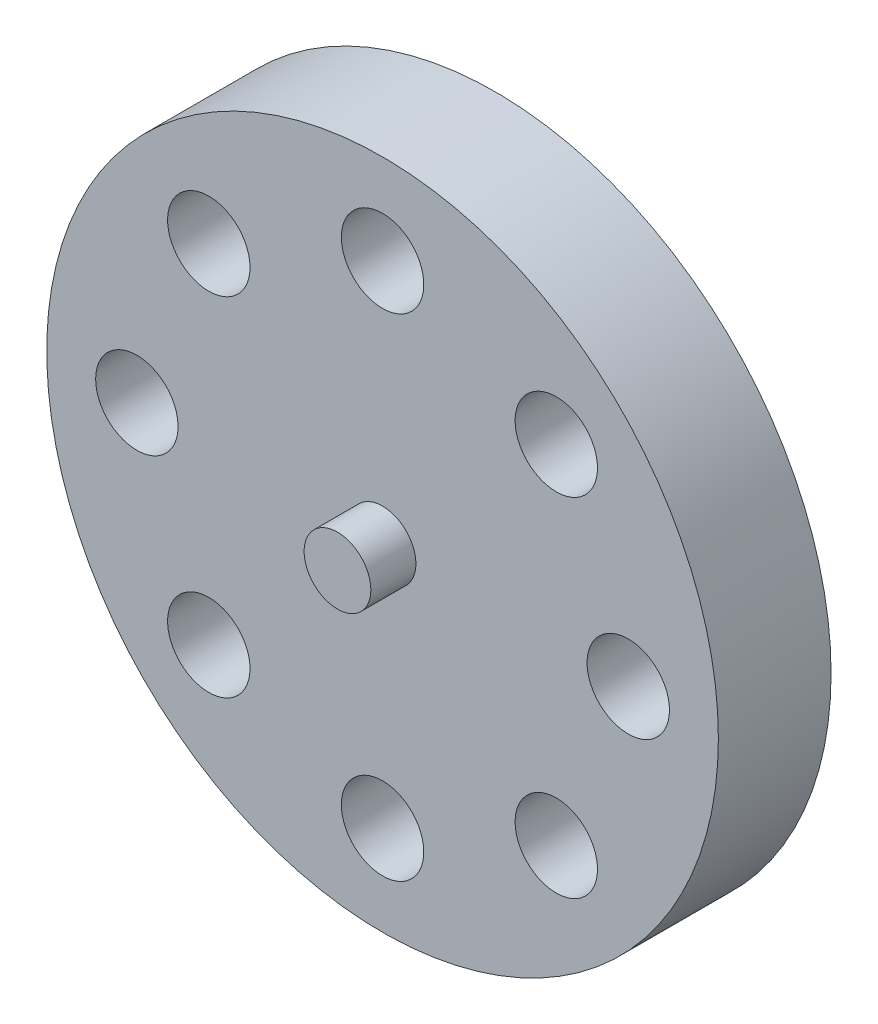
ISO-10303-21;
HEADER;
FILE_DESCRIPTION(('STEP AP214'),'2;1');
FILE_NAME('part.step','',(''),(''),'','','');
FILE_SCHEMA(('AUTOMOTIVE_DESIGN { 1 0 10303 214 1 1 1 1 }'));
ENDSEC;
DATA;
#1=APPLICATION_CONTEXT('core data for automotive mechanical design processes');
#2=APPLICATION_PROTOCOL_DEFINITION('international standard','automotive_design',2000,#1);
#3=PRODUCT_CONTEXT('',#1,'mechanical');
#4=PRODUCT('Part','Part','',(#3));
#5=PRODUCT_RELATED_PRODUCT_CATEGORY('part','',(#4));
#6=PRODUCT_DEFINITION_FORMATION('','',#4);
#7=PRODUCT_DEFINITION_CONTEXT('part definition',#1,'design');
#8=PRODUCT_DEFINITION('design','',#6,#7);
#9=PRODUCT_DEFINITION_SHAPE('','',#8);
#10=(LENGTH_UNIT() NAMED_UNIT(*) SI_UNIT(.MILLI.,.METRE.));
#11=(NAMED_UNIT(*) PLANE_ANGLE_UNIT() SI_UNIT($,.RADIAN.));
#12=(NAMED_UNIT(*) SI_UNIT($,.STERADIAN.) SOLID_ANGLE_UNIT());
#13=UNCERTAINTY_MEASURE_WITH_UNIT(LENGTH_MEASURE(1.E-05),#10,'distance_accuracy_value','');
#14=(GEOMETRIC_REPRESENTATION_CONTEXT(3) GLOBAL_UNCERTAINTY_ASSIGNED_CONTEXT((#13)) GLOBAL_UNIT_ASSIGNED_CONTEXT((#10,
#11,#12)) REPRESENTATION_CONTEXT('',''));
#15=CARTESIAN_POINT('',(0.,0.,0.));
#16=DIRECTION('',(0.,0.,1.));
#17=DIRECTION('',(1.,0.,0.));
#18=AXIS2_PLACEMENT_3D('',#15,#16,#17);
#19=CARTESIAN_POINT('',(0.,0.,12.7));
#20=DIRECTION('',(0.,0.,-1.));
#21=DIRECTION('',(-1.,0.,0.));
#22=AXIS2_PLACEMENT_3D('',#19,#20,#21);
#23=CYLINDRICAL_SURFACE('',#22,37.8431460674157);
#24=CARTESIAN_POINT('',(0.,0.,12.7));
#25=DIRECTION('',(0.,0.,1.));
#26=DIRECTION('',(1.,0.,0.));
#27=AXIS2_PLACEMENT_3D('',#24,#25,#26);
#28=CIRCLE('',#27,37.8431460674157);
#29=CARTESIAN_POINT('',(37.8431460674157,0.,12.7));
#30=VERTEX_POINT('',#29);
#31=EDGE_CURVE('E10',#30,#30,#28,.T.);
#32=ORIENTED_EDGE('',*,*,#31,.F.);
#33=EDGE_LOOP('',(#32));
#34=FACE_BOUND('',#33,.T.);
#35=CARTESIAN_POINT('',(0.,0.,0.));
#36=DIRECTION('',(0.,0.,1.));
#37=DIRECTION('',(1.,0.,0.));
#38=AXIS2_PLACEMENT_3D('',#35,#36,#37);
#39=CIRCLE('',#38,37.8431460674157);
#40=CARTESIAN_POINT('',(37.8431460674157,0.,0.));
#41=VERTEX_POINT('',#40);
#42=EDGE_CURVE('E45',#41,#41,#39,.T.);
#43=ORIENTED_EDGE('',*,*,#42,.T.);
#44=EDGE_LOOP('',(#43));
#45=FACE_BOUND('',#44,.T.);
#46=ADVANCED_FACE('F42',(#34,#45),#23,.T.);
#47=CARTESIAN_POINT('',(0.,0.,12.7));
#48=DIRECTION('',(0.,0.,1.));
#49=DIRECTION('',(1.,0.,0.));
#50=AXIS2_PLACEMENT_3D('',#47,#48,#49);
#51=PLANE('',#50);
#52=CARTESIAN_POINT('',(0.,-27.6881748320218,12.7));
#53=DIRECTION('',(0.,0.,1.));
#54=DIRECTION('',(0.,-1.,0.));
#55=AXIS2_PLACEMENT_3D('',#52,#53,#54);
#56=CIRCLE('',#55,4.64293997584229);
#57=CARTESIAN_POINT('',(-1.12883484015652E-13,-32.3311148078641,12.7));
#58=VERTEX_POINT('',#57);
#59=EDGE_CURVE('E105',#58,#58,#56,.T.);
#60=ORIENTED_EDGE('',*,*,#59,.F.);
#61=EDGE_LOOP('',(#60));
#62=FACE_BOUND('',#61,.T.);
#63=CARTESIAN_POINT('',(-19.5784961824014,-19.5784961824012,12.7));
#64=DIRECTION('',(0.,0.,1.));
#65=DIRECTION('',(-0.707106781186551,-0.707106781186544,0.));
#66=AXIS2_PLACEMENT_3D('',#63,#64,#65);
#67=CIRCLE('',#66,4.64293997584229);
#68=CARTESIAN_POINT('',(-22.8615505239616,-22.8615505239614,12.7));
#69=VERTEX_POINT('',#68);
#70=EDGE_CURVE('E97',#69,#69,#67,.T.);
#71=ORIENTED_EDGE('',*,*,#70,.F.);
#72=EDGE_LOOP('',(#71));
#73=FACE_BOUND('',#72,.T.);
#74=CARTESIAN_POINT('',(-27.6881748320218,0.,12.7));
#75=DIRECTION('',(0.,0.,1.));
#76=DIRECTION('',(-1.,0.,0.));
#77=AXIS2_PLACEMENT_3D('',#74,#75,#76);
#78=CIRCLE('',#77,4.64293997584229);
#79=CARTESIAN_POINT('',(-32.3311148078641,0.,12.7));
#80=VERTEX_POINT('',#79);
#81=EDGE_CURVE('E89',#80,#80,#78,.T.);
#82=ORIENTED_EDGE('',*,*,#81,.F.);
#83=EDGE_LOOP('',(#82));
#84=FACE_BOUND('',#83,.T.);
#85=CARTESIAN_POINT('',(-19.5784961824011,19.5784961824015,12.7));
#86=DIRECTION('',(0.,0.,1.));
#87=DIRECTION('',(-0.707106781186541,0.707106781186554,0.));
#88=AXIS2_PLACEMENT_3D('',#85,#86,#87);
#89=CIRCLE('',#88,4.64293997584229);
#90=CARTESIAN_POINT('',(-22.8615505239613,22.8615505239617,12.7));
#91=VERTEX_POINT('',#90);
#92=EDGE_CURVE('E80',#91,#91,#89,.T.);
#93=ORIENTED_EDGE('',*,*,#92,.F.);
#94=EDGE_LOOP('',(#93));
#95=FACE_BOUND('',#94,.T.);
#96=CARTESIAN_POINT('',(2.9001823719789E-13,27.6881748320218,12.7));
#97=DIRECTION('',(0.,0.,1.));
#98=DIRECTION('',(0.,1.,0.));
#99=AXIS2_PLACEMENT_3D('',#96,#97,#98);
#100=CIRCLE('',#99,4.64293997584229);
#101=CARTESIAN_POINT('',(3.38650452046957E-13,32.3311148078641,12.7));
#102=VERTEX_POINT('',#101);
#103=EDGE_CURVE('E120',#102,#102,#100,.T.);
#104=ORIENTED_EDGE('',*,*,#103,.F.);
#105=EDGE_LOOP('',(#104));
#106=FACE_BOUND('',#105,.T.);
#107=CARTESIAN_POINT('',(19.5784961824015,19.5784961824011,12.7));
#108=DIRECTION('',(0.,0.,1.));
#109=DIRECTION('',(0.707106781186556,0.707106781186539,0.));
#110=AXIS2_PLACEMENT_3D('',#107,#108,#109);
#111=CIRCLE('',#110,4.64293997584229);
#112=CARTESIAN_POINT('',(22.8615505239617,22.8615505239612,12.7));
#113=VERTEX_POINT('',#112);
#114=EDGE_CURVE('E112',#113,#113,#111,.T.);
#115=ORIENTED_EDGE('',*,*,#114,.F.);
#116=EDGE_LOOP('',(#115));
#117=FACE_BOUND('',#116,.T.);
#118=CARTESIAN_POINT('',(19.5784961824013,-19.5784961824013,12.7));
#119=DIRECTION('',(0.,0.,1.));
#120=DIRECTION('',(0.707106781186546,-0.707106781186549,0.));
#121=AXIS2_PLACEMENT_3D('',#118,#119,#120);
#122=CIRCLE('',#121,4.64293997584229);
#123=CARTESIAN_POINT('',(22.8615505239614,-22.8615505239615,12.7));
#124=VERTEX_POINT('',#123);
#125=EDGE_CURVE('E72',#124,#124,#122,.T.);
#126=ORIENTED_EDGE('',*,*,#125,.F.);
#127=EDGE_LOOP('',(#126));
#128=FACE_BOUND('',#127,.T.);
#129=CARTESIAN_POINT('',(27.6881748320218,0.,12.7));
#130=DIRECTION('',(0.,0.,1.));
#131=DIRECTION('',(1.,0.,0.));
#132=AXIS2_PLACEMENT_3D('',#129,#130,#131);
#133=CIRCLE('',#132,4.64293997584229);
#134=CARTESIAN_POINT('',(32.3311148078641,0.,12.7));
#135=VERTEX_POINT('',#134);
#136=EDGE_CURVE('E64',#135,#135,#133,.T.);
#137=ORIENTED_EDGE('',*,*,#136,.F.);
#138=EDGE_LOOP('',(#137));
#139=FACE_BOUND('',#138,.T.);
#140=CARTESIAN_POINT('',(0.,0.,12.7));
#141=DIRECTION('',(0.,0.,1.));
#142=DIRECTION('',(1.,0.,0.));
#143=AXIS2_PLACEMENT_3D('',#140,#141,#142);
#144=CIRCLE('',#143,3.75949529829291);
#145=CARTESIAN_POINT('',(3.75949529829291,0.,12.7));
#146=VERTEX_POINT('',#145);
#147=EDGE_CURVE('E56',#146,#146,#144,.T.);
#148=ORIENTED_EDGE('',*,*,#147,.F.);
#149=EDGE_LOOP('',(#148));
#150=FACE_BOUND('',#149,.T.);
#151=ORIENTED_EDGE('',*,*,#31,.T.);
#152=EDGE_LOOP('',(#151));
#153=FACE_BOUND('',#152,.T.);
#154=ADVANCED_FACE('F139',(#62,#73,#84,#95,#106,#117,#128,#139,#150,#153),#51,.T.);
#155=CARTESIAN_POINT('',(0.,0.,0.));
#156=DIRECTION('',(0.,0.,1.));
#157=DIRECTION('',(1.,0.,0.));
#158=AXIS2_PLACEMENT_3D('',#155,#156,#157);
#159=PLANE('',#158);
#160=CARTESIAN_POINT('',(0.,-27.6881748320218,0.));
#161=DIRECTION('',(0.,0.,1.));
#162=DIRECTION('',(0.,-1.,0.));
#163=AXIS2_PLACEMENT_3D('',#160,#161,#162);
#164=CIRCLE('',#163,4.64293997584229);
#165=CARTESIAN_POINT('',(-1.12883484015652E-13,-32.3311148078641,0.));
#166=VERTEX_POINT('',#165);
#167=EDGE_CURVE('E76',#166,#166,#164,.T.);
#168=ORIENTED_EDGE('',*,*,#167,.T.);
#169=EDGE_LOOP('',(#168));
#170=FACE_BOUND('',#169,.T.);
#171=CARTESIAN_POINT('',(-19.5784961824014,-19.5784961824012,0.));
#172=DIRECTION('',(0.,0.,1.));
#173=DIRECTION('',(-0.707106781186551,-0.707106781186544,0.));
#174=AXIS2_PLACEMENT_3D('',#171,#172,#173);
#175=CIRCLE('',#174,4.64293997584229);
#176=CARTESIAN_POINT('',(-22.8615505239616,-22.8615505239614,0.));
#177=VERTEX_POINT('',#176);
#178=EDGE_CURVE('E101',#177,#177,#175,.T.);
#179=ORIENTED_EDGE('',*,*,#178,.T.);
#180=EDGE_LOOP('',(#179));
#181=FACE_BOUND('',#180,.T.);
#182=CARTESIAN_POINT('',(-27.6881748320218,0.,0.));
#183=DIRECTION('',(0.,0.,1.));
#184=DIRECTION('',(-1.,0.,0.));
#185=AXIS2_PLACEMENT_3D('',#182,#183,#184);
#186=CIRCLE('',#185,4.64293997584229);
#187=CARTESIAN_POINT('',(-32.3311148078641,0.,0.));
#188=VERTEX_POINT('',#187);
#189=EDGE_CURVE('E93',#188,#188,#186,.T.);
#190=ORIENTED_EDGE('',*,*,#189,.T.);
#191=EDGE_LOOP('',(#190));
#192=FACE_BOUND('',#191,.T.);
#193=CARTESIAN_POINT('',(-19.5784961824011,19.5784961824015,0.));
#194=DIRECTION('',(0.,0.,1.));
#195=DIRECTION('',(-0.707106781186541,0.707106781186554,0.));
#196=AXIS2_PLACEMENT_3D('',#193,#194,#195);
#197=CIRCLE('',#196,4.64293997584229);
#198=CARTESIAN_POINT('',(-22.8615505239613,22.8615505239617,0.));
#199=VERTEX_POINT('',#198);
#200=EDGE_CURVE('E84',#199,#199,#197,.T.);
#201=ORIENTED_EDGE('',*,*,#200,.T.);
#202=EDGE_LOOP('',(#201));
#203=FACE_BOUND('',#202,.T.);
#204=CARTESIAN_POINT('',(2.9001823719789E-13,27.6881748320218,0.));
#205=DIRECTION('',(0.,0.,1.));
#206=DIRECTION('',(0.,1.,0.));
#207=AXIS2_PLACEMENT_3D('',#204,#205,#206);
#208=CIRCLE('',#207,4.64293997584229);
#209=CARTESIAN_POINT('',(3.38650452046957E-13,32.3311148078641,0.));
#210=VERTEX_POINT('',#209);
#211=EDGE_CURVE('E85',#210,#210,#208,.T.);
#212=ORIENTED_EDGE('',*,*,#211,.T.);
#213=EDGE_LOOP('',(#212));
#214=FACE_BOUND('',#213,.T.);
#215=CARTESIAN_POINT('',(19.5784961824015,19.5784961824011,0.));
#216=DIRECTION('',(0.,0.,1.));
#217=DIRECTION('',(0.707106781186556,0.707106781186539,0.));
#218=AXIS2_PLACEMENT_3D('',#215,#216,#217);
#219=CIRCLE('',#218,4.64293997584229);
#220=CARTESIAN_POINT('',(22.8615505239617,22.8615505239612,0.));
#221=VERTEX_POINT('',#220);
#222=EDGE_CURVE('E116',#221,#221,#219,.T.);
#223=ORIENTED_EDGE('',*,*,#222,.T.);
#224=EDGE_LOOP('',(#223));
#225=FACE_BOUND('',#224,.T.);
#226=CARTESIAN_POINT('',(19.5784961824013,-19.5784961824013,0.));
#227=DIRECTION('',(0.,0.,1.));
#228=DIRECTION('',(0.707106781186546,-0.707106781186549,0.));
#229=AXIS2_PLACEMENT_3D('',#226,#227,#228);
#230=CIRCLE('',#229,4.64293997584229);
#231=CARTESIAN_POINT('',(22.8615505239614,-22.8615505239615,0.));
#232=VERTEX_POINT('',#231);
#233=EDGE_CURVE('E68',#232,#232,#230,.T.);
#234=ORIENTED_EDGE('',*,*,#233,.T.);
#235=EDGE_LOOP('',(#234));
#236=FACE_BOUND('',#235,.T.);
#237=CARTESIAN_POINT('',(27.6881748320218,0.,0.));
#238=DIRECTION('',(0.,0.,1.));
#239=DIRECTION('',(1.,0.,0.));
#240=AXIS2_PLACEMENT_3D('',#237,#238,#239);
#241=CIRCLE('',#240,4.64293997584229);
#242=CARTESIAN_POINT('',(32.3311148078641,0.,0.));
#243=VERTEX_POINT('',#242);
#244=EDGE_CURVE('E60',#243,#243,#241,.T.);
#245=ORIENTED_EDGE('',*,*,#244,.T.);
#246=EDGE_LOOP('',(#245));
#247=FACE_BOUND('',#246,.T.);
#248=ORIENTED_EDGE('',*,*,#42,.F.);
#249=EDGE_LOOP('',(#248));
#250=FACE_BOUND('',#249,.T.);
#251=ADVANCED_FACE('F128',(#170,#181,#192,#203,#214,#225,#236,#247,#250),#159,.F.);
#252=CARTESIAN_POINT('',(0.,0.,17.78));
#253=DIRECTION('',(0.,0.,-1.));
#254=DIRECTION('',(-1.,0.,0.));
#255=AXIS2_PLACEMENT_3D('',#252,#253,#254);
#256=CYLINDRICAL_SURFACE('',#255,3.75949529829291);
#257=CARTESIAN_POINT('',(0.,0.,17.78));
#258=DIRECTION('',(0.,0.,1.));
#259=DIRECTION('',(1.,0.,0.));
#260=AXIS2_PLACEMENT_3D('',#257,#258,#259);
#261=CIRCLE('',#260,3.75949529829291);
#262=CARTESIAN_POINT('',(3.75949529829291,0.,17.78));
#263=VERTEX_POINT('',#262);
#264=EDGE_CURVE('E54',#263,#263,#261,.T.);
#265=ORIENTED_EDGE('',*,*,#264,.F.);
#266=EDGE_LOOP('',(#265));
#267=FACE_BOUND('',#266,.T.);
#268=ORIENTED_EDGE('',*,*,#147,.T.);
#269=EDGE_LOOP('',(#268));
#270=FACE_BOUND('',#269,.T.);
#271=ADVANCED_FACE('F152',(#267,#270),#256,.T.);
#272=CARTESIAN_POINT('',(0.,0.,17.78));
#273=DIRECTION('',(0.,0.,1.));
#274=DIRECTION('',(1.,0.,0.));
#275=AXIS2_PLACEMENT_3D('',#272,#273,#274);
#276=PLANE('',#275);
#277=ORIENTED_EDGE('',*,*,#264,.T.);
#278=EDGE_LOOP('',(#277));
#279=FACE_BOUND('',#278,.T.);
#280=ADVANCED_FACE('F154',(#279),#276,.T.);
#281=CARTESIAN_POINT('',(27.6881748320218,0.,0.));
#282=DIRECTION('',(0.,0.,1.));
#283=DIRECTION('',(1.,0.,0.));
#284=AXIS2_PLACEMENT_3D('',#281,#282,#283);
#285=CYLINDRICAL_SURFACE('',#284,4.64293997584229);
#286=ORIENTED_EDGE('',*,*,#244,.F.);
#287=EDGE_LOOP('',(#286));
#288=FACE_BOUND('',#287,.T.);
#289=ORIENTED_EDGE('',*,*,#136,.T.);
#290=EDGE_LOOP('',(#289));
#291=FACE_BOUND('',#290,.T.);
#292=ADVANCED_FACE('F161',(#288,#291),#285,.F.);
#293=CARTESIAN_POINT('',(19.5784961824013,-19.5784961824013,0.));
#294=DIRECTION('',(0.,0.,1.));
#295=DIRECTION('',(1.,0.,0.));
#296=AXIS2_PLACEMENT_3D('',#293,#294,#295);
#297=CYLINDRICAL_SURFACE('',#296,4.64293997584229);
#298=ORIENTED_EDGE('',*,*,#233,.F.);
#299=EDGE_LOOP('',(#298));
#300=FACE_BOUND('',#299,.T.);
#301=ORIENTED_EDGE('',*,*,#125,.T.);
#302=EDGE_LOOP('',(#301));
#303=FACE_BOUND('',#302,.T.);
#304=ADVANCED_FACE('F201',(#300,#303),#297,.F.);
#305=CARTESIAN_POINT('',(19.5784961824015,19.5784961824011,0.));
#306=DIRECTION('',(0.,0.,1.));
#307=DIRECTION('',(1.,0.,0.));
#308=AXIS2_PLACEMENT_3D('',#305,#306,#307);
#309=CYLINDRICAL_SURFACE('',#308,4.64293997584229);
#310=ORIENTED_EDGE('',*,*,#222,.F.);
#311=EDGE_LOOP('',(#310));
#312=FACE_BOUND('',#311,.T.);
#313=ORIENTED_EDGE('',*,*,#114,.T.);
#314=EDGE_LOOP('',(#313));
#315=FACE_BOUND('',#314,.T.);
#316=ADVANCED_FACE('F135',(#312,#315),#309,.F.);
#317=CARTESIAN_POINT('',(2.9001823719789E-13,27.6881748320218,0.));
#318=DIRECTION('',(0.,0.,1.));
#319=DIRECTION('',(1.,0.,0.));
#320=AXIS2_PLACEMENT_3D('',#317,#318,#319);
#321=CYLINDRICAL_SURFACE('',#320,4.64293997584229);
#322=ORIENTED_EDGE('',*,*,#211,.F.);
#323=EDGE_LOOP('',(#322));
#324=FACE_BOUND('',#323,.T.);
#325=ORIENTED_EDGE('',*,*,#103,.T.);
#326=EDGE_LOOP('',(#325));
#327=FACE_BOUND('',#326,.T.);
#328=ADVANCED_FACE('F131',(#324,#327),#321,.F.);
#329=CARTESIAN_POINT('',(-19.5784961824011,19.5784961824015,0.));
#330=DIRECTION('',(0.,0.,1.));
#331=DIRECTION('',(1.,0.,0.));
#332=AXIS2_PLACEMENT_3D('',#329,#330,#331);
#333=CYLINDRICAL_SURFACE('',#332,4.64293997584229);
#334=ORIENTED_EDGE('',*,*,#200,.F.);
#335=EDGE_LOOP('',(#334));
#336=FACE_BOUND('',#335,.T.);
#337=ORIENTED_EDGE('',*,*,#92,.T.);
#338=EDGE_LOOP('',(#337));
#339=FACE_BOUND('',#338,.T.);
#340=ADVANCED_FACE('F134',(#336,#339),#333,.F.);
#341=CARTESIAN_POINT('',(-27.6881748320218,0.,0.));
#342=DIRECTION('',(0.,0.,1.));
#343=DIRECTION('',(1.,0.,0.));
#344=AXIS2_PLACEMENT_3D('',#341,#342,#343);
#345=CYLINDRICAL_SURFACE('',#344,4.64293997584229);
#346=ORIENTED_EDGE('',*,*,#189,.F.);
#347=EDGE_LOOP('',(#346));
#348=FACE_BOUND('',#347,.T.);
#349=ORIENTED_EDGE('',*,*,#81,.T.);
#350=EDGE_LOOP('',(#349));
#351=FACE_BOUND('',#350,.T.);
#352=ADVANCED_FACE('F234',(#348,#351),#345,.F.);
#353=CARTESIAN_POINT('',(-19.5784961824014,-19.5784961824012,0.));
#354=DIRECTION('',(0.,0.,1.));
#355=DIRECTION('',(1.,0.,0.));
#356=AXIS2_PLACEMENT_3D('',#353,#354,#355);
#357=CYLINDRICAL_SURFACE('',#356,4.64293997584229);
#358=ORIENTED_EDGE('',*,*,#178,.F.);
#359=EDGE_LOOP('',(#358));
#360=FACE_BOUND('',#359,.T.);
#361=ORIENTED_EDGE('',*,*,#70,.T.);
#362=EDGE_LOOP('',(#361));
#363=FACE_BOUND('',#362,.T.);
#364=ADVANCED_FACE('F244',(#360,#363),#357,.F.);
#365=CARTESIAN_POINT('',(0.,-27.6881748320218,0.));
#366=DIRECTION('',(0.,0.,1.));
#367=DIRECTION('',(1.,0.,0.));
#368=AXIS2_PLACEMENT_3D('',#365,#366,#367);
#369=CYLINDRICAL_SURFACE('',#368,4.64293997584229);
#370=ORIENTED_EDGE('',*,*,#167,.F.);
#371=EDGE_LOOP('',(#370));
#372=FACE_BOUND('',#371,.T.);
#373=ORIENTED_EDGE('',*,*,#59,.T.);
#374=EDGE_LOOP('',(#373));
#375=FACE_BOUND('',#374,.T.);
#376=ADVANCED_FACE('F254',(#372,#375),#369,.F.);
#377=CLOSED_SHELL('',(#46,#154,#251,#271,#280,#292,#304,#316,#328,#340,#352,#364,#376));
#378=MANIFOLD_SOLID_BREP('B2',#377);
#379=ADVANCED_BREP_SHAPE_REPRESENTATION('',(#18,#378),#14);
#380=SHAPE_DEFINITION_REPRESENTATION(#9,#379);
ENDSEC;
END-ISO-10303-21;
